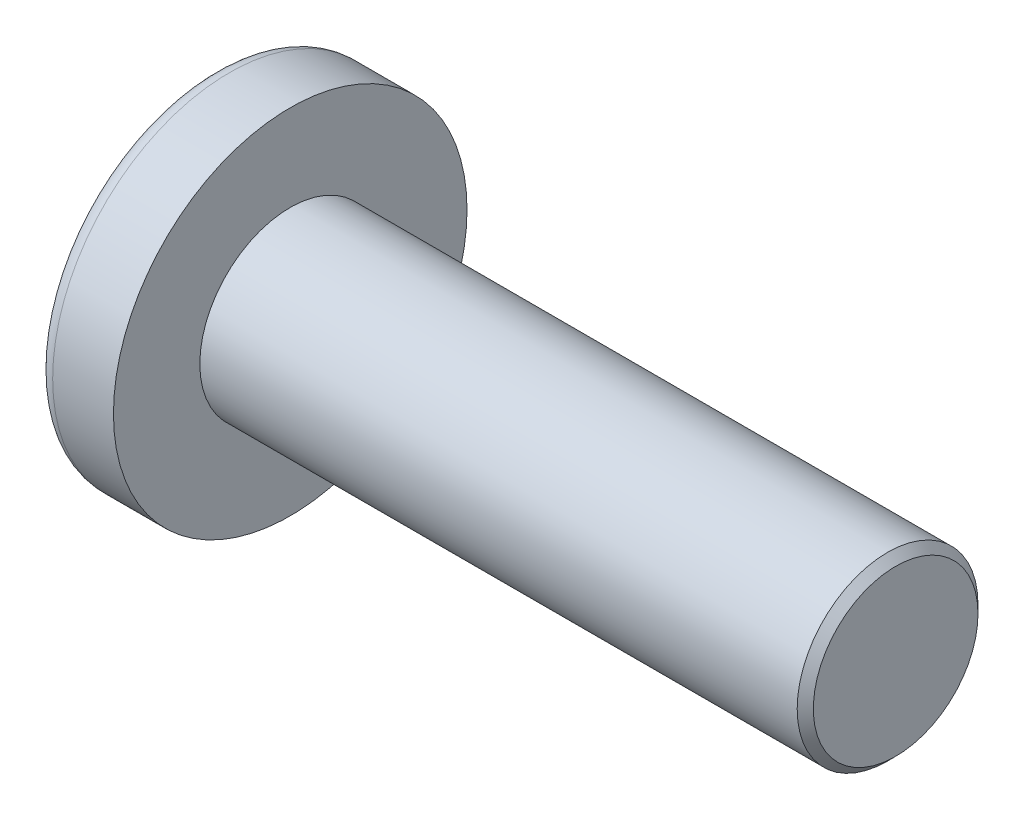
ISO-10303-21;
HEADER;
FILE_DESCRIPTION(('STEP AP214'),'2;1');
FILE_NAME('part.step','',(''),(''),'','','');
FILE_SCHEMA(('AUTOMOTIVE_DESIGN { 1 0 10303 214 1 1 1 1 }'));
ENDSEC;
DATA;
#1=APPLICATION_CONTEXT('core data for automotive mechanical design processes');
#2=APPLICATION_PROTOCOL_DEFINITION('international standard','automotive_design',2000,#1);
#3=PRODUCT_CONTEXT('',#1,'mechanical');
#4=PRODUCT('Part','Part','',(#3));
#5=PRODUCT_RELATED_PRODUCT_CATEGORY('part','',(#4));
#6=PRODUCT_DEFINITION_FORMATION('','',#4);
#7=PRODUCT_DEFINITION_CONTEXT('part definition',#1,'design');
#8=PRODUCT_DEFINITION('design','',#6,#7);
#9=PRODUCT_DEFINITION_SHAPE('','',#8);
#10=(LENGTH_UNIT() NAMED_UNIT(*) SI_UNIT(.MILLI.,.METRE.));
#11=(NAMED_UNIT(*) PLANE_ANGLE_UNIT() SI_UNIT($,.RADIAN.));
#12=(NAMED_UNIT(*) SI_UNIT($,.STERADIAN.) SOLID_ANGLE_UNIT());
#13=UNCERTAINTY_MEASURE_WITH_UNIT(LENGTH_MEASURE(1.E-05),#10,'distance_accuracy_value','');
#14=(GEOMETRIC_REPRESENTATION_CONTEXT(3) GLOBAL_UNCERTAINTY_ASSIGNED_CONTEXT((#13)) GLOBAL_UNIT_ASSIGNED_CONTEXT((#10,
#11,#12)) REPRESENTATION_CONTEXT('',''));
#15=CARTESIAN_POINT('',(0.,0.,0.));
#16=DIRECTION('',(0.,0.,1.));
#17=DIRECTION('',(1.,0.,0.));
#18=AXIS2_PLACEMENT_3D('',#15,#16,#17);
#19=CARTESIAN_POINT('',(4.55168,0.,0.));
#20=DIRECTION('',(-1.,0.,0.));
#21=DIRECTION('',(0.,1.,0.));
#22=AXIS2_PLACEMENT_3D('',#19,#20,#21);
#23=SPHERICAL_SURFACE('',#22,4.55168);
#24=CARTESIAN_POINT('',(0.870207289833471,0.,0.));
#25=DIRECTION('',(-1.,0.,0.));
#26=DIRECTION('',(0.,0.,1.));
#27=AXIS2_PLACEMENT_3D('',#24,#25,#26);
#28=CIRCLE('',#27,2.67666761229315);
#29=CARTESIAN_POINT('',(0.870207289833471,0.,2.67666761229315));
#30=VERTEX_POINT('',#29);
#31=EDGE_CURVE('E141',#30,#30,#28,.T.);
#32=ORIENTED_EDGE('',*,*,#31,.T.);
#33=EDGE_LOOP('',(#32));
#34=FACE_BOUND('',#33,.T.);
#35=CARTESIAN_POINT('',(4.54621406502776,-0.053976107850912,0.));
#36=DIRECTION('',(-0.100750553686815,-0.9949117176573,0.));
#37=DIRECTION('',(0.994911717657301,-0.100750553686815,0.));
#38=AXIS2_PLACEMENT_3D('',#35,#36,#37);
#39=CIRCLE('',#38,4.55135666870178);
#40=CARTESIAN_POINT('',(0.29828010421487,0.376194419826337,1.57634320737159));
#41=VERTEX_POINT('',#40);
#42=CARTESIAN_POINT('',(0.0357821905509178,0.402776487032817,0.402776487032818));
#43=VERTEX_POINT('',#42);
#44=EDGE_CURVE('E137',#41,#43,#39,.T.);
#45=ORIENTED_EDGE('',*,*,#44,.F.);
#46=CARTESIAN_POINT('',(3.65196023945684,0.,-1.11933639500645));
#47=DIRECTION('',(0.626498155753381,0.,0.77942290243334));
#48=DIRECTION('',(0.77942290243334,0.,-0.626498155753381));
#49=AXIS2_PLACEMENT_3D('',#46,#47,#48);
#50=CIRCLE('',#49,4.31918756361681);
#51=CARTESIAN_POINT('',(0.298280104214868,-0.376194419826347,1.57634320737159));
#52=VERTEX_POINT('',#51);
#53=EDGE_CURVE('E129',#41,#52,#50,.T.);
#54=ORIENTED_EDGE('',*,*,#53,.T.);
#55=CARTESIAN_POINT('',(4.54621406502775,0.053976107850911,0.));
#56=DIRECTION('',(-0.100750553686815,0.994911717657301,0.));
#57=DIRECTION('',(-0.994911717657301,-0.100750553686815,0.));
#58=AXIS2_PLACEMENT_3D('',#55,#56,#57);
#59=CIRCLE('',#58,4.55135666870178);
#60=CARTESIAN_POINT('',(0.0357821905509178,-0.402776487032819,0.402776487032818));
#61=VERTEX_POINT('',#60);
#62=EDGE_CURVE('E381',#61,#52,#59,.T.);
#63=ORIENTED_EDGE('',*,*,#62,.F.);
#64=CARTESIAN_POINT('',(4.54621406502775,0.,-0.0539761078509111));
#65=DIRECTION('',(-0.100750553686815,0.,-0.994911717657301));
#66=DIRECTION('',(-0.994911717657301,0.,0.100750553686815));
#67=AXIS2_PLACEMENT_3D('',#64,#65,#66);
#68=CIRCLE('',#67,4.55135666870178);
#69=CARTESIAN_POINT('',(0.298280104214867,-1.57634320737159,0.376194419826342));
#70=VERTEX_POINT('',#69);
#71=EDGE_CURVE('E175',#70,#61,#68,.T.);
#72=ORIENTED_EDGE('',*,*,#71,.F.);
#73=CARTESIAN_POINT('',(3.65196023945684,1.11933639500645,0.));
#74=DIRECTION('',(0.626498155753381,-0.77942290243334,0.));
#75=DIRECTION('',(0.77942290243334,0.626498155753381,0.));
#76=AXIS2_PLACEMENT_3D('',#73,#74,#75);
#77=CIRCLE('',#76,4.31918756361681);
#78=CARTESIAN_POINT('',(0.298280104214867,-1.57634320737159,-0.376194419826343));
#79=VERTEX_POINT('',#78);
#80=EDGE_CURVE('E171',#70,#79,#77,.T.);
#81=ORIENTED_EDGE('',*,*,#80,.T.);
#82=CARTESIAN_POINT('',(4.54621406502775,0.,0.053976107850912));
#83=DIRECTION('',(-0.100750553686815,0.,0.9949117176573));
#84=DIRECTION('',(0.994911717657301,0.,0.100750553686815));
#85=AXIS2_PLACEMENT_3D('',#82,#83,#84);
#86=CIRCLE('',#85,4.55135666870178);
#87=CARTESIAN_POINT('',(0.0357821905509169,-0.402776487032816,-0.402776487032819));
#88=VERTEX_POINT('',#87);
#89=EDGE_CURVE('E55',#88,#79,#86,.T.);
#90=ORIENTED_EDGE('',*,*,#89,.F.);
#91=CARTESIAN_POINT('',(0.298280104214869,-0.376194419826336,-1.57634320737159));
#92=VERTEX_POINT('',#91);
#93=EDGE_CURVE('E379',#92,#88,#59,.T.);
#94=ORIENTED_EDGE('',*,*,#93,.F.);
#95=CARTESIAN_POINT('',(3.65196023945684,0.,1.11933639500645));
#96=DIRECTION('',(0.626498155753381,0.,-0.77942290243334));
#97=DIRECTION('',(-0.77942290243334,0.,-0.626498155753381));
#98=AXIS2_PLACEMENT_3D('',#95,#96,#97);
#99=CIRCLE('',#98,4.31918756361681);
#100=CARTESIAN_POINT('',(0.29828010421487,0.376194419826348,-1.57634320737159));
#101=VERTEX_POINT('',#100);
#102=EDGE_CURVE('E386',#92,#101,#99,.T.);
#103=ORIENTED_EDGE('',*,*,#102,.T.);
#104=CARTESIAN_POINT('',(0.0357821905509186,0.40277648703282,-0.402776487032818));
#105=VERTEX_POINT('',#104);
#106=EDGE_CURVE('E114',#105,#101,#39,.T.);
#107=ORIENTED_EDGE('',*,*,#106,.F.);
#108=CARTESIAN_POINT('',(0.29828010421487,1.57634320737159,-0.376194419826342));
#109=VERTEX_POINT('',#108);
#110=EDGE_CURVE('E136',#109,#105,#86,.T.);
#111=ORIENTED_EDGE('',*,*,#110,.F.);
#112=CARTESIAN_POINT('',(3.65196023945684,-1.11933639500645,0.));
#113=DIRECTION('',(0.626498155753381,0.77942290243334,0.));
#114=DIRECTION('',(-0.77942290243334,0.626498155753381,0.));
#115=AXIS2_PLACEMENT_3D('',#112,#113,#114);
#116=CIRCLE('',#115,4.31918756361681);
#117=CARTESIAN_POINT('',(0.29828010421487,1.57634320737159,0.376194419826342));
#118=VERTEX_POINT('',#117);
#119=EDGE_CURVE('E63',#109,#118,#116,.T.);
#120=ORIENTED_EDGE('',*,*,#119,.T.);
#121=EDGE_CURVE('E174',#43,#118,#68,.T.);
#122=ORIENTED_EDGE('',*,*,#121,.F.);
#123=EDGE_LOOP('',(#45,#54,#63,#72,#81,#90,#94,#103,#107,#111,#120,#122));
#124=FACE_BOUND('',#123,.T.);
#125=ADVANCED_FACE('F40',(#34,#124),#23,.T.);
#126=CARTESIAN_POINT('',(2.2594,0.,-0.1776));
#127=DIRECTION('',(-0.100750553686815,0.,0.9949117176573));
#128=DIRECTION('',(0.994911717657301,0.,0.100750553686815));
#129=AXIS2_PLACEMENT_3D('',#126,#127,#128);
#130=PLANE('',#129);
#131=ORIENTED_EDGE('',*,*,#110,.T.);
#132=DIRECTION('',(0.989900325021556,-0.100243070888259,0.100243070888259));
#133=VECTOR('',#132,1.);
#134=CARTESIAN_POINT('',(2.27702336316533,0.175815355628828,-0.175815355628827));
#135=LINE('',#134,#133);
#136=CARTESIAN_POINT('',(2.0066,0.203200000000001,-0.203199999999999));
#137=VERTEX_POINT('',#136);
#138=EDGE_CURVE('E112',#105,#137,#135,.T.);
#139=ORIENTED_EDGE('',*,*,#138,.T.);
#140=DIRECTION('',(0.777006374114706,-0.624555756408656,0.0786841897837678));
#141=VECTOR('',#140,1.);
#142=CARTESIAN_POINT('',(0.,1.8161,-0.4064));
#143=LINE('',#142,#141);
#144=EDGE_CURVE('E134',#109,#137,#143,.T.);
#145=ORIENTED_EDGE('',*,*,#144,.F.);
#146=EDGE_LOOP('',(#131,#139,#145));
#147=FACE_BOUND('',#146,.T.);
#148=ADVANCED_FACE('F133',(#147),#130,.T.);
#149=DIRECTION('',(0.777006374114707,0.624555756408656,0.0786841897837678));
#150=VECTOR('',#149,1.);
#151=CARTESIAN_POINT('',(0.,-1.8161,-0.4064));
#152=LINE('',#151,#150);
#153=CARTESIAN_POINT('',(2.0066,-0.2032,-0.2032));
#154=VERTEX_POINT('',#153);
#155=EDGE_CURVE('E156',#79,#154,#152,.T.);
#156=ORIENTED_EDGE('',*,*,#155,.T.);
#157=DIRECTION('',(-0.989900325021557,-0.100243070888258,-0.100243070888259));
#158=VECTOR('',#157,1.);
#159=CARTESIAN_POINT('',(2.27702336316533,-0.175815355628826,-0.175815355628827));
#160=LINE('',#159,#158);
#161=EDGE_CURVE('E370',#154,#88,#160,.T.);
#162=ORIENTED_EDGE('',*,*,#161,.T.);
#163=ORIENTED_EDGE('',*,*,#89,.T.);
#164=EDGE_LOOP('',(#156,#162,#163));
#165=FACE_BOUND('',#164,.T.);
#166=ADVANCED_FACE('F204',(#165),#130,.T.);
#167=CARTESIAN_POINT('',(2.2594,0.,0.1776));
#168=DIRECTION('',(-0.100750553686815,0.,-0.994911717657301));
#169=DIRECTION('',(-0.994911717657301,0.,0.100750553686815));
#170=AXIS2_PLACEMENT_3D('',#167,#168,#169);
#171=PLANE('',#170);
#172=DIRECTION('',(0.777006374114706,-0.624555756408657,-0.0786841897837675));
#173=VECTOR('',#172,1.);
#174=CARTESIAN_POINT('',(0.,1.8161,0.406399999999999));
#175=LINE('',#174,#173);
#176=CARTESIAN_POINT('',(2.0066,0.2032,0.2032));
#177=VERTEX_POINT('',#176);
#178=EDGE_CURVE('E142',#118,#177,#175,.T.);
#179=ORIENTED_EDGE('',*,*,#178,.T.);
#180=DIRECTION('',(-0.989900325021557,0.100243070888259,0.100243070888259));
#181=VECTOR('',#180,1.);
#182=CARTESIAN_POINT('',(2.27702336316533,0.175815355628826,0.175815355628827));
#183=LINE('',#182,#181);
#184=EDGE_CURVE('E376',#177,#43,#183,.T.);
#185=ORIENTED_EDGE('',*,*,#184,.T.);
#186=ORIENTED_EDGE('',*,*,#121,.T.);
#187=EDGE_LOOP('',(#179,#185,#186));
#188=FACE_BOUND('',#187,.T.);
#189=ADVANCED_FACE('F235',(#188),#171,.T.);
#190=ORIENTED_EDGE('',*,*,#71,.T.);
#191=DIRECTION('',(0.989900325021556,0.100243070888259,-0.100243070888259));
#192=VECTOR('',#191,1.);
#193=CARTESIAN_POINT('',(2.27702336316533,-0.175815355628828,0.175815355628827));
#194=LINE('',#193,#192);
#195=CARTESIAN_POINT('',(2.0066,-0.203200000000001,0.203199999999999));
#196=VERTEX_POINT('',#195);
#197=EDGE_CURVE('E383',#61,#196,#194,.T.);
#198=ORIENTED_EDGE('',*,*,#197,.T.);
#199=DIRECTION('',(0.777006374114707,0.624555756408656,-0.0786841897837674));
#200=VECTOR('',#199,1.);
#201=CARTESIAN_POINT('',(0.,-1.8161,0.406399999999999));
#202=LINE('',#201,#200);
#203=EDGE_CURVE('E153',#70,#196,#202,.T.);
#204=ORIENTED_EDGE('',*,*,#203,.F.);
#205=EDGE_LOOP('',(#190,#198,#204));
#206=FACE_BOUND('',#205,.T.);
#207=ADVANCED_FACE('F224',(#206),#171,.T.);
#208=CARTESIAN_POINT('',(-25.4,0.,0.));
#209=DIRECTION('',(-1.,0.,0.));
#210=DIRECTION('',(0.,0.,1.));
#211=AXIS2_PLACEMENT_3D('',#208,#209,#210);
#212=CYLINDRICAL_SURFACE('',#211,1.4224);
#213=CARTESIAN_POINT('',(11.43,0.,0.));
#214=DIRECTION('',(1.,0.,0.));
#215=DIRECTION('',(0.,0.,-1.));
#216=AXIS2_PLACEMENT_3D('',#213,#214,#215);
#217=CIRCLE('',#216,1.4224);
#218=CARTESIAN_POINT('',(11.43,0.,-1.4224));
#219=VERTEX_POINT('',#218);
#220=EDGE_CURVE('E48',#219,#219,#217,.F.);
#221=ORIENTED_EDGE('',*,*,#220,.T.);
#222=EDGE_LOOP('',(#221));
#223=FACE_BOUND('',#222,.T.);
#224=CARTESIAN_POINT('',(2.032,0.,0.));
#225=DIRECTION('',(-1.,0.,0.));
#226=DIRECTION('',(0.,0.,1.));
#227=AXIS2_PLACEMENT_3D('',#224,#225,#226);
#228=CIRCLE('',#227,1.4224);
#229=CARTESIAN_POINT('',(2.032,0.,1.4224));
#230=VERTEX_POINT('',#229);
#231=EDGE_CURVE('E168',#230,#230,#228,.T.);
#232=ORIENTED_EDGE('',*,*,#231,.F.);
#233=EDGE_LOOP('',(#232));
#234=FACE_BOUND('',#233,.T.);
#235=ADVANCED_FACE('F42',(#223,#234),#212,.T.);
#236=CARTESIAN_POINT('',(2.032,1.4224,0.));
#237=DIRECTION('',(-1.,0.,0.));
#238=DIRECTION('',(0.,0.,1.));
#239=AXIS2_PLACEMENT_3D('',#236,#237,#238);
#240=PLANE('',#239);
#241=CARTESIAN_POINT('',(2.032,0.,0.));
#242=DIRECTION('',(-1.,0.,0.));
#243=DIRECTION('',(0.,0.,1.));
#244=AXIS2_PLACEMENT_3D('',#241,#242,#243);
#245=CIRCLE('',#244,2.7813);
#246=CARTESIAN_POINT('',(2.032,0.,2.7813));
#247=VERTEX_POINT('',#246);
#248=EDGE_CURVE('E165',#247,#247,#245,.T.);
#249=ORIENTED_EDGE('',*,*,#248,.F.);
#250=EDGE_LOOP('',(#249));
#251=FACE_BOUND('',#250,.T.);
#252=ORIENTED_EDGE('',*,*,#231,.T.);
#253=EDGE_LOOP('',(#252));
#254=FACE_BOUND('',#253,.T.);
#255=ADVANCED_FACE('F217',(#251,#254),#240,.F.);
#256=CARTESIAN_POINT('',(-25.4,0.,0.));
#257=DIRECTION('',(-1.,0.,0.));
#258=DIRECTION('',(0.,0.,1.));
#259=AXIS2_PLACEMENT_3D('',#256,#257,#258);
#260=CYLINDRICAL_SURFACE('',#259,2.7813);
#261=ORIENTED_EDGE('',*,*,#248,.T.);
#262=EDGE_LOOP('',(#261));
#263=FACE_BOUND('',#262,.T.);
#264=CARTESIAN_POINT('',(1.07564661517759,0.,0.));
#265=DIRECTION('',(-1.,0.,0.));
#266=DIRECTION('',(0.,0.,1.));
#267=AXIS2_PLACEMENT_3D('',#264,#265,#266);
#268=CIRCLE('',#267,2.7813);
#269=CARTESIAN_POINT('',(1.07564661517759,0.,2.7813));
#270=VERTEX_POINT('',#269);
#271=EDGE_CURVE('E162',#270,#270,#268,.T.);
#272=ORIENTED_EDGE('',*,*,#271,.F.);
#273=EDGE_LOOP('',(#272));
#274=FACE_BOUND('',#273,.T.);
#275=ADVANCED_FACE('F214',(#263,#274),#260,.T.);
#276=CARTESIAN_POINT('',(1.07564661517759,0.,0.));
#277=DIRECTION('',(-1.,0.,0.));
#278=DIRECTION('',(0.,0.,1.));
#279=AXIS2_PLACEMENT_3D('',#276,#277,#278);
#280=TOROIDAL_SURFACE('',#279,2.5273,0.254);
#281=ORIENTED_EDGE('',*,*,#271,.T.);
#282=EDGE_LOOP('',(#281));
#283=FACE_BOUND('',#282,.T.);
#284=ORIENTED_EDGE('',*,*,#31,.F.);
#285=EDGE_LOOP('',(#284));
#286=FACE_BOUND('',#285,.T.);
#287=ADVANCED_FACE('F211',(#283,#286),#280,.T.);
#288=CARTESIAN_POINT('',(11.557,1.4224,0.));
#289=DIRECTION('',(1.,0.,0.));
#290=DIRECTION('',(0.,0.,-1.));
#291=AXIS2_PLACEMENT_3D('',#288,#289,#290);
#292=PLANE('',#291);
#293=CARTESIAN_POINT('',(11.557,0.,0.));
#294=DIRECTION('',(1.,0.,0.));
#295=DIRECTION('',(0.,0.,-1.));
#296=AXIS2_PLACEMENT_3D('',#293,#294,#295);
#297=CIRCLE('',#296,1.2954);
#298=CARTESIAN_POINT('',(11.557,0.,-1.2954));
#299=VERTEX_POINT('',#298);
#300=EDGE_CURVE('E11',#299,#299,#297,.T.);
#301=ORIENTED_EDGE('',*,*,#300,.T.);
#302=EDGE_LOOP('',(#301));
#303=FACE_BOUND('',#302,.T.);
#304=ADVANCED_FACE('F209',(#303),#292,.T.);
#305=CARTESIAN_POINT('',(2.0066,0.2032,0.2032));
#306=DIRECTION('',(0.626498155753381,0.77942290243334,0.));
#307=DIRECTION('',(-0.77942290243334,0.626498155753381,0.));
#308=AXIS2_PLACEMENT_3D('',#305,#306,#307);
#309=PLANE('',#308);
#310=ORIENTED_EDGE('',*,*,#144,.T.);
#311=DIRECTION('',(0.,0.,-1.));
#312=VECTOR('',#311,1.);
#313=CARTESIAN_POINT('',(2.0066,0.2032,0.2032));
#314=LINE('',#313,#312);
#315=EDGE_CURVE('E128',#177,#137,#314,.T.);
#316=ORIENTED_EDGE('',*,*,#315,.F.);
#317=ORIENTED_EDGE('',*,*,#178,.F.);
#318=ORIENTED_EDGE('',*,*,#119,.F.);
#319=EDGE_LOOP('',(#310,#316,#317,#318));
#320=FACE_BOUND('',#319,.T.);
#321=ADVANCED_FACE('F140',(#320),#309,.F.);
#322=CARTESIAN_POINT('',(2.0066,-0.2032,-0.2032));
#323=DIRECTION('',(0.626498155753381,-0.77942290243334,0.));
#324=DIRECTION('',(0.77942290243334,0.626498155753381,0.));
#325=AXIS2_PLACEMENT_3D('',#322,#323,#324);
#326=PLANE('',#325);
#327=ORIENTED_EDGE('',*,*,#203,.T.);
#328=DIRECTION('',(0.,0.,1.));
#329=VECTOR('',#328,1.);
#330=CARTESIAN_POINT('',(2.0066,-0.2032,-0.2032));
#331=LINE('',#330,#329);
#332=EDGE_CURVE('E149',#154,#196,#331,.T.);
#333=ORIENTED_EDGE('',*,*,#332,.F.);
#334=ORIENTED_EDGE('',*,*,#155,.F.);
#335=ORIENTED_EDGE('',*,*,#80,.F.);
#336=EDGE_LOOP('',(#327,#333,#334,#335));
#337=FACE_BOUND('',#336,.T.);
#338=ADVANCED_FACE('F243',(#337),#326,.F.);
#339=CARTESIAN_POINT('',(2.0066,0.2032,-0.2032));
#340=DIRECTION('',(-1.,0.,0.));
#341=DIRECTION('',(0.,0.,1.));
#342=AXIS2_PLACEMENT_3D('',#339,#340,#341);
#343=PLANE('',#342);
#344=DIRECTION('',(0.,1.,0.));
#345=VECTOR('',#344,1.);
#346=CARTESIAN_POINT('',(2.0066,-0.2032,-0.2032));
#347=LINE('',#346,#345);
#348=EDGE_CURVE('E121',#154,#137,#347,.T.);
#349=ORIENTED_EDGE('',*,*,#348,.F.);
#350=ORIENTED_EDGE('',*,*,#332,.T.);
#351=DIRECTION('',(0.,-1.,0.));
#352=VECTOR('',#351,1.);
#353=CARTESIAN_POINT('',(2.0066,0.2032,0.2032));
#354=LINE('',#353,#352);
#355=EDGE_CURVE('E147',#177,#196,#354,.T.);
#356=ORIENTED_EDGE('',*,*,#355,.F.);
#357=ORIENTED_EDGE('',*,*,#315,.T.);
#358=EDGE_LOOP('',(#349,#350,#356,#357));
#359=FACE_BOUND('',#358,.T.);
#360=ADVANCED_FACE('F145',(#359),#343,.T.);
#361=CARTESIAN_POINT('',(2.0066,0.203200000000001,-0.203199999999999));
#362=DIRECTION('',(0.626498155753381,0.,-0.77942290243334));
#363=DIRECTION('',(0.77942290243334,0.,0.626498155753381));
#364=AXIS2_PLACEMENT_3D('',#361,#362,#363);
#365=PLANE('',#364);
#366=DIRECTION('',(0.777006374114707,0.0786841897837653,0.624555756408656));
#367=VECTOR('',#366,1.);
#368=CARTESIAN_POINT('',(0.,-0.406399999999993,-1.8161));
#369=LINE('',#368,#367);
#370=EDGE_CURVE('E118',#92,#154,#369,.T.);
#371=ORIENTED_EDGE('',*,*,#370,.T.);
#372=ORIENTED_EDGE('',*,*,#348,.T.);
#373=DIRECTION('',(0.777006374114707,-0.0786841897837699,0.624555756408656));
#374=VECTOR('',#373,1.);
#375=CARTESIAN_POINT('',(0.,0.406400000000006,-1.8161));
#376=LINE('',#375,#374);
#377=EDGE_CURVE('E108',#101,#137,#376,.T.);
#378=ORIENTED_EDGE('',*,*,#377,.F.);
#379=ORIENTED_EDGE('',*,*,#102,.F.);
#380=EDGE_LOOP('',(#371,#372,#378,#379));
#381=FACE_BOUND('',#380,.T.);
#382=ADVANCED_FACE('F122',(#381),#365,.F.);
#383=CARTESIAN_POINT('',(2.2594,-0.1776,0.));
#384=DIRECTION('',(-0.100750553686815,0.994911717657301,0.));
#385=DIRECTION('',(-0.994911717657301,-0.100750553686815,0.));
#386=AXIS2_PLACEMENT_3D('',#383,#384,#385);
#387=PLANE('',#386);
#388=ORIENTED_EDGE('',*,*,#93,.T.);
#389=ORIENTED_EDGE('',*,*,#161,.F.);
#390=ORIENTED_EDGE('',*,*,#370,.F.);
#391=EDGE_LOOP('',(#388,#389,#390));
#392=FACE_BOUND('',#391,.T.);
#393=ADVANCED_FACE('F195',(#392),#387,.T.);
#394=CARTESIAN_POINT('',(2.2594,0.1776,0.));
#395=DIRECTION('',(-0.100750553686815,-0.9949117176573,0.));
#396=DIRECTION('',(0.994911717657301,-0.100750553686815,0.));
#397=AXIS2_PLACEMENT_3D('',#394,#395,#396);
#398=PLANE('',#397);
#399=ORIENTED_EDGE('',*,*,#106,.T.);
#400=ORIENTED_EDGE('',*,*,#377,.T.);
#401=ORIENTED_EDGE('',*,*,#138,.F.);
#402=EDGE_LOOP('',(#399,#400,#401));
#403=FACE_BOUND('',#402,.T.);
#404=ADVANCED_FACE('F110',(#403),#398,.T.);
#405=CARTESIAN_POINT('',(2.0066,-0.203200000000001,0.203199999999999));
#406=DIRECTION('',(0.626498155753381,0.,0.77942290243334));
#407=DIRECTION('',(-0.77942290243334,0.,0.626498155753381));
#408=AXIS2_PLACEMENT_3D('',#405,#406,#407);
#409=PLANE('',#408);
#410=DIRECTION('',(0.777006374114706,-0.0786841897837656,-0.624555756408657));
#411=VECTOR('',#410,1.);
#412=CARTESIAN_POINT('',(0.,0.406399999999994,1.8161));
#413=LINE('',#412,#411);
#414=EDGE_CURVE('E388',#41,#177,#413,.T.);
#415=ORIENTED_EDGE('',*,*,#414,.T.);
#416=ORIENTED_EDGE('',*,*,#355,.T.);
#417=DIRECTION('',(0.777006374114706,0.0786841897837697,-0.624555756408656));
#418=VECTOR('',#417,1.);
#419=CARTESIAN_POINT('',(0.,-0.406400000000006,1.8161));
#420=LINE('',#419,#418);
#421=EDGE_CURVE('E117',#52,#196,#420,.T.);
#422=ORIENTED_EDGE('',*,*,#421,.F.);
#423=ORIENTED_EDGE('',*,*,#53,.F.);
#424=EDGE_LOOP('',(#415,#416,#422,#423));
#425=FACE_BOUND('',#424,.T.);
#426=ADVANCED_FACE('F289',(#425),#409,.F.);
#427=ORIENTED_EDGE('',*,*,#44,.T.);
#428=ORIENTED_EDGE('',*,*,#184,.F.);
#429=ORIENTED_EDGE('',*,*,#414,.F.);
#430=EDGE_LOOP('',(#427,#428,#429));
#431=FACE_BOUND('',#430,.T.);
#432=ADVANCED_FACE('F192',(#431),#398,.T.);
#433=ORIENTED_EDGE('',*,*,#62,.T.);
#434=ORIENTED_EDGE('',*,*,#421,.T.);
#435=ORIENTED_EDGE('',*,*,#197,.F.);
#436=EDGE_LOOP('',(#433,#434,#435));
#437=FACE_BOUND('',#436,.T.);
#438=ADVANCED_FACE('F186',(#437),#387,.T.);
#439=CARTESIAN_POINT('',(11.43,0.,0.));
#440=DIRECTION('',(-1.,0.,0.));
#441=DIRECTION('',(0.,0.,1.));
#442=AXIS2_PLACEMENT_3D('',#439,#440,#441);
#443=CONICAL_SURFACE('',#442,1.4224,0.785398163397444);
#444=ORIENTED_EDGE('',*,*,#300,.F.);
#445=EDGE_LOOP('',(#444));
#446=FACE_BOUND('',#445,.T.);
#447=ORIENTED_EDGE('',*,*,#220,.F.);
#448=EDGE_LOOP('',(#447));
#449=FACE_BOUND('',#448,.T.);
#450=ADVANCED_FACE('F184',(#446,#449),#443,.T.);
#451=CLOSED_SHELL('',(#125,#148,#166,#189,#207,#235,#255,#275,#287,#304,#321,#338,#360,#382,
#393,#404,#426,#432,#438,#450));
#452=MANIFOLD_SOLID_BREP('B2',#451);
#453=ADVANCED_BREP_SHAPE_REPRESENTATION('',(#18,#452),#14);
#454=SHAPE_DEFINITION_REPRESENTATION(#9,#453);
ENDSEC;
END-ISO-10303-21;
